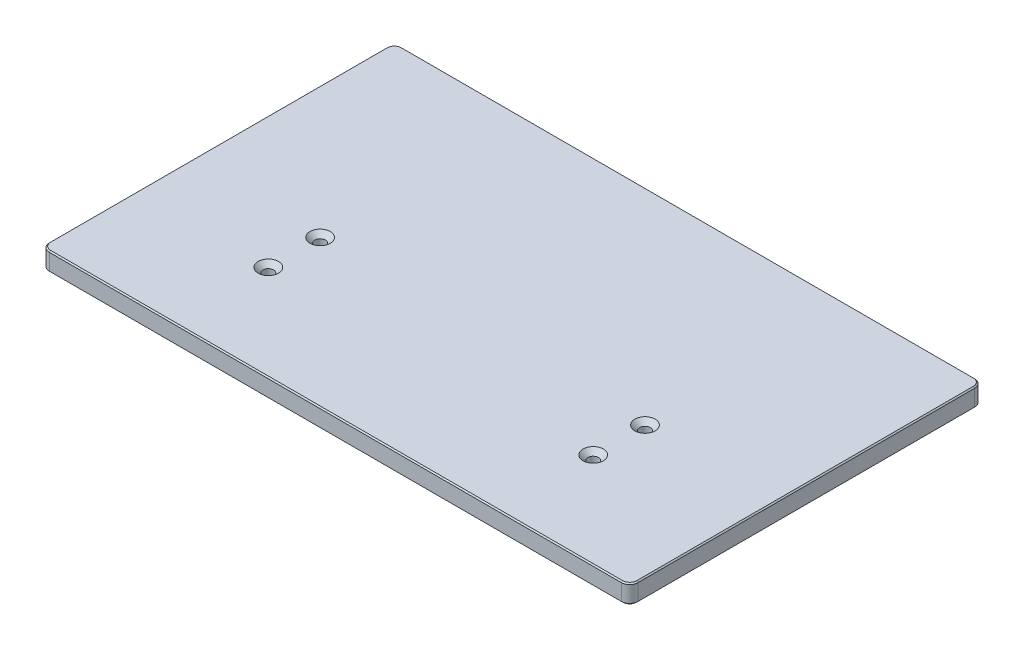
ISO-10303-21;
HEADER;
FILE_DESCRIPTION(('STEP AP214'),'2;1');
FILE_NAME('part.step','',(''),(''),'','','');
FILE_SCHEMA(('AUTOMOTIVE_DESIGN { 1 0 10303 214 1 1 1 1 }'));
ENDSEC;
DATA;
#1=APPLICATION_CONTEXT('core data for automotive mechanical design processes');
#2=APPLICATION_PROTOCOL_DEFINITION('international standard','automotive_design',2000,#1);
#3=PRODUCT_CONTEXT('',#1,'mechanical');
#4=PRODUCT('Part','Part','',(#3));
#5=PRODUCT_RELATED_PRODUCT_CATEGORY('part','',(#4));
#6=PRODUCT_DEFINITION_FORMATION('','',#4);
#7=PRODUCT_DEFINITION_CONTEXT('part definition',#1,'design');
#8=PRODUCT_DEFINITION('design','',#6,#7);
#9=PRODUCT_DEFINITION_SHAPE('','',#8);
#10=(LENGTH_UNIT() NAMED_UNIT(*) SI_UNIT(.MILLI.,.METRE.));
#11=(NAMED_UNIT(*) PLANE_ANGLE_UNIT() SI_UNIT($,.RADIAN.));
#12=(NAMED_UNIT(*) SI_UNIT($,.STERADIAN.) SOLID_ANGLE_UNIT());
#13=UNCERTAINTY_MEASURE_WITH_UNIT(LENGTH_MEASURE(1.E-05),#10,'distance_accuracy_value','');
#14=(GEOMETRIC_REPRESENTATION_CONTEXT(3) GLOBAL_UNCERTAINTY_ASSIGNED_CONTEXT((#13)) GLOBAL_UNIT_ASSIGNED_CONTEXT((#10,
#11,#12)) REPRESENTATION_CONTEXT('',''));
#15=CARTESIAN_POINT('',(0.,0.,0.));
#16=DIRECTION('',(0.,0.,1.));
#17=DIRECTION('',(1.,0.,0.));
#18=AXIS2_PLACEMENT_3D('',#15,#16,#17);
#19=CARTESIAN_POINT('',(0.,0.,0.));
#20=DIRECTION('',(0.,-1.,0.));
#21=DIRECTION('',(0.,0.,-1.));
#22=AXIS2_PLACEMENT_3D('',#19,#20,#21);
#23=PLANE('',#22);
#24=CARTESIAN_POINT('',(243.,0.,-143.));
#25=DIRECTION('',(0.,-1.,0.));
#26=DIRECTION('',(0.,0.,-1.));
#27=AXIS2_PLACEMENT_3D('',#24,#25,#26);
#28=CIRCLE('',#27,6.00000000000001);
#29=CARTESIAN_POINT('',(243.,0.,-149.));
#30=VERTEX_POINT('',#29);
#31=CARTESIAN_POINT('',(249.,0.,-143.));
#32=VERTEX_POINT('',#31);
#33=EDGE_CURVE('E224',#30,#32,#28,.T.);
#34=ORIENTED_EDGE('',*,*,#33,.T.);
#35=DIRECTION('',(0.,0.,1.));
#36=VECTOR('',#35,1.);
#37=CARTESIAN_POINT('',(249.,0.,143.));
#38=LINE('',#37,#36);
#39=CARTESIAN_POINT('',(249.,0.,143.));
#40=VERTEX_POINT('',#39);
#41=EDGE_CURVE('E170',#32,#40,#38,.T.);
#42=ORIENTED_EDGE('',*,*,#41,.T.);
#43=CARTESIAN_POINT('',(243.,0.,143.));
#44=DIRECTION('',(0.,-1.,0.));
#45=DIRECTION('',(0.,0.,-1.));
#46=AXIS2_PLACEMENT_3D('',#43,#44,#45);
#47=CIRCLE('',#46,6.00000000000001);
#48=CARTESIAN_POINT('',(243.,0.,149.));
#49=VERTEX_POINT('',#48);
#50=EDGE_CURVE('E222',#40,#49,#47,.T.);
#51=ORIENTED_EDGE('',*,*,#50,.T.);
#52=DIRECTION('',(-1.,0.,0.));
#53=VECTOR('',#52,1.);
#54=CARTESIAN_POINT('',(-243.,0.,149.));
#55=LINE('',#54,#53);
#56=CARTESIAN_POINT('',(-243.,0.,149.));
#57=VERTEX_POINT('',#56);
#58=EDGE_CURVE('E218',#49,#57,#55,.T.);
#59=ORIENTED_EDGE('',*,*,#58,.T.);
#60=CARTESIAN_POINT('',(-243.,0.,143.));
#61=DIRECTION('',(0.,-1.,0.));
#62=DIRECTION('',(0.,0.,-1.));
#63=AXIS2_PLACEMENT_3D('',#60,#61,#62);
#64=CIRCLE('',#63,6.00000000000001);
#65=CARTESIAN_POINT('',(-249.,0.,143.));
#66=VERTEX_POINT('',#65);
#67=EDGE_CURVE('E214',#57,#66,#64,.T.);
#68=ORIENTED_EDGE('',*,*,#67,.T.);
#69=DIRECTION('',(0.,0.,-1.));
#70=VECTOR('',#69,1.);
#71=CARTESIAN_POINT('',(-249.,0.,-143.));
#72=LINE('',#71,#70);
#73=CARTESIAN_POINT('',(-249.,0.,-143.));
#74=VERTEX_POINT('',#73);
#75=EDGE_CURVE('E196',#66,#74,#72,.T.);
#76=ORIENTED_EDGE('',*,*,#75,.T.);
#77=CARTESIAN_POINT('',(-243.,0.,-143.));
#78=DIRECTION('',(0.,-1.,0.));
#79=DIRECTION('',(0.,0.,-1.));
#80=AXIS2_PLACEMENT_3D('',#77,#78,#79);
#81=CIRCLE('',#80,6.00000000000001);
#82=CARTESIAN_POINT('',(-243.,0.,-149.));
#83=VERTEX_POINT('',#82);
#84=EDGE_CURVE('E216',#74,#83,#81,.T.);
#85=ORIENTED_EDGE('',*,*,#84,.T.);
#86=DIRECTION('',(1.,0.,0.));
#87=VECTOR('',#86,1.);
#88=CARTESIAN_POINT('',(243.,0.,-149.));
#89=LINE('',#88,#87);
#90=EDGE_CURVE('E220',#83,#30,#89,.T.);
#91=ORIENTED_EDGE('',*,*,#90,.T.);
#92=EDGE_LOOP('',(#34,#42,#51,#59,#68,#76,#85,#91));
#93=FACE_BOUND('',#92,.T.);
#94=CARTESIAN_POINT('',(138.,0.,69.));
#95=DIRECTION('',(0.,1.,0.));
#96=DIRECTION('',(0.,0.,1.));
#97=AXIS2_PLACEMENT_3D('',#94,#95,#96);
#98=CIRCLE('',#97,4.5);
#99=CARTESIAN_POINT('',(138.,0.,73.5));
#100=VERTEX_POINT('',#99);
#101=EDGE_CURVE('E283',#100,#100,#98,.T.);
#102=ORIENTED_EDGE('',*,*,#101,.T.);
#103=EDGE_LOOP('',(#102));
#104=FACE_BOUND('',#103,.T.);
#105=CARTESIAN_POINT('',(138.,0.,25.));
#106=DIRECTION('',(0.,1.,0.));
#107=DIRECTION('',(0.,0.,1.));
#108=AXIS2_PLACEMENT_3D('',#105,#106,#107);
#109=CIRCLE('',#108,4.5);
#110=CARTESIAN_POINT('',(138.,0.,29.5));
#111=VERTEX_POINT('',#110);
#112=EDGE_CURVE('E734',#111,#111,#109,.T.);
#113=ORIENTED_EDGE('',*,*,#112,.T.);
#114=EDGE_LOOP('',(#113));
#115=FACE_BOUND('',#114,.T.);
#116=CARTESIAN_POINT('',(-138.,0.,69.));
#117=DIRECTION('',(0.,1.,0.));
#118=DIRECTION('',(0.,0.,1.));
#119=AXIS2_PLACEMENT_3D('',#116,#117,#118);
#120=CIRCLE('',#119,4.5);
#121=CARTESIAN_POINT('',(-138.,0.,73.5));
#122=VERTEX_POINT('',#121);
#123=EDGE_CURVE('E745',#122,#122,#120,.T.);
#124=ORIENTED_EDGE('',*,*,#123,.T.);
#125=EDGE_LOOP('',(#124));
#126=FACE_BOUND('',#125,.T.);
#127=CARTESIAN_POINT('',(-138.,0.,25.));
#128=DIRECTION('',(0.,1.,0.));
#129=DIRECTION('',(0.,0.,1.));
#130=AXIS2_PLACEMENT_3D('',#127,#128,#129);
#131=CIRCLE('',#130,4.5);
#132=CARTESIAN_POINT('',(-138.,0.,29.5));
#133=VERTEX_POINT('',#132);
#134=EDGE_CURVE('E754',#133,#133,#131,.T.);
#135=ORIENTED_EDGE('',*,*,#134,.T.);
#136=EDGE_LOOP('',(#135));
#137=FACE_BOUND('',#136,.T.);
#138=ADVANCED_FACE('F45',(#93,#104,#115,#126,#137),#23,.T.);
#139=CARTESIAN_POINT('',(250.,15.875,150.));
#140=DIRECTION('',(-1.,0.,0.));
#141=DIRECTION('',(0.,0.,1.));
#142=AXIS2_PLACEMENT_3D('',#139,#140,#141);
#143=PLANE('',#142);
#144=DIRECTION('',(0.,-1.,0.));
#145=VECTOR('',#144,1.);
#146=CARTESIAN_POINT('',(250.,15.875,143.));
#147=LINE('',#146,#145);
#148=CARTESIAN_POINT('',(250.,14.8750000000001,143.));
#149=VERTEX_POINT('',#148);
#150=CARTESIAN_POINT('',(250.,0.999999999999945,143.));
#151=VERTEX_POINT('',#150);
#152=EDGE_CURVE('E194',#149,#151,#147,.T.);
#153=ORIENTED_EDGE('',*,*,#152,.T.);
#154=DIRECTION('',(0.,0.,-1.));
#155=VECTOR('',#154,1.);
#156=CARTESIAN_POINT('',(250.,0.999999999999945,-143.));
#157=LINE('',#156,#155);
#158=CARTESIAN_POINT('',(250.,0.999999999999945,-143.));
#159=VERTEX_POINT('',#158);
#160=EDGE_CURVE('E168',#151,#159,#157,.T.);
#161=ORIENTED_EDGE('',*,*,#160,.T.);
#162=DIRECTION('',(0.,-1.,0.));
#163=VECTOR('',#162,1.);
#164=CARTESIAN_POINT('',(250.,15.875,-143.));
#165=LINE('',#164,#163);
#166=CARTESIAN_POINT('',(250.,14.8750000000001,-143.));
#167=VERTEX_POINT('',#166);
#168=EDGE_CURVE('E192',#159,#167,#165,.F.);
#169=ORIENTED_EDGE('',*,*,#168,.T.);
#170=DIRECTION('',(0.,0.,1.));
#171=VECTOR('',#170,1.);
#172=CARTESIAN_POINT('',(250.,14.8750000000001,150.));
#173=LINE('',#172,#171);
#174=EDGE_CURVE('E197',#167,#149,#173,.T.);
#175=ORIENTED_EDGE('',*,*,#174,.T.);
#176=EDGE_LOOP('',(#153,#161,#169,#175));
#177=FACE_BOUND('',#176,.T.);
#178=ADVANCED_FACE('F190',(#177),#143,.F.);
#179=CARTESIAN_POINT('',(-250.,15.875,-150.));
#180=DIRECTION('',(0.,0.,1.));
#181=DIRECTION('',(1.,0.,0.));
#182=AXIS2_PLACEMENT_3D('',#179,#180,#181);
#183=PLANE('',#182);
#184=DIRECTION('',(0.,-1.,0.));
#185=VECTOR('',#184,1.);
#186=CARTESIAN_POINT('',(243.,15.875,-150.));
#187=LINE('',#186,#185);
#188=CARTESIAN_POINT('',(243.,14.8750000000001,-150.));
#189=VERTEX_POINT('',#188);
#190=CARTESIAN_POINT('',(243.,0.999999999999945,-150.));
#191=VERTEX_POINT('',#190);
#192=EDGE_CURVE('E325',#189,#191,#187,.T.);
#193=ORIENTED_EDGE('',*,*,#192,.T.);
#194=DIRECTION('',(-1.,0.,0.));
#195=VECTOR('',#194,1.);
#196=CARTESIAN_POINT('',(-243.,0.999999999999945,-150.));
#197=LINE('',#196,#195);
#198=CARTESIAN_POINT('',(-243.,0.999999999999945,-150.));
#199=VERTEX_POINT('',#198);
#200=EDGE_CURVE('E233',#191,#199,#197,.T.);
#201=ORIENTED_EDGE('',*,*,#200,.T.);
#202=DIRECTION('',(0.,-1.,0.));
#203=VECTOR('',#202,1.);
#204=CARTESIAN_POINT('',(-243.,15.875,-150.));
#205=LINE('',#204,#203);
#206=CARTESIAN_POINT('',(-243.,14.8750000000001,-150.));
#207=VERTEX_POINT('',#206);
#208=EDGE_CURVE('E206',#199,#207,#205,.F.);
#209=ORIENTED_EDGE('',*,*,#208,.T.);
#210=DIRECTION('',(1.,0.,0.));
#211=VECTOR('',#210,1.);
#212=CARTESIAN_POINT('',(-250.,14.8750000000001,-150.));
#213=LINE('',#212,#211);
#214=EDGE_CURVE('E231',#207,#189,#213,.T.);
#215=ORIENTED_EDGE('',*,*,#214,.T.);
#216=EDGE_LOOP('',(#193,#201,#209,#215));
#217=FACE_BOUND('',#216,.T.);
#218=ADVANCED_FACE('F332',(#217),#183,.F.);
#219=CARTESIAN_POINT('',(-250.,15.875,150.));
#220=DIRECTION('',(1.,0.,0.));
#221=DIRECTION('',(0.,0.,-1.));
#222=AXIS2_PLACEMENT_3D('',#219,#220,#221);
#223=PLANE('',#222);
#224=DIRECTION('',(0.,-1.,0.));
#225=VECTOR('',#224,1.);
#226=CARTESIAN_POINT('',(-250.,15.875,-143.));
#227=LINE('',#226,#225);
#228=CARTESIAN_POINT('',(-250.,14.8750000000001,-143.));
#229=VERTEX_POINT('',#228);
#230=CARTESIAN_POINT('',(-250.,0.999999999999945,-143.));
#231=VERTEX_POINT('',#230);
#232=EDGE_CURVE('E317',#229,#231,#227,.T.);
#233=ORIENTED_EDGE('',*,*,#232,.T.);
#234=DIRECTION('',(0.,0.,1.));
#235=VECTOR('',#234,1.);
#236=CARTESIAN_POINT('',(-250.,0.999999999999945,143.));
#237=LINE('',#236,#235);
#238=CARTESIAN_POINT('',(-250.,0.999999999999945,143.));
#239=VERTEX_POINT('',#238);
#240=EDGE_CURVE('E249',#231,#239,#237,.T.);
#241=ORIENTED_EDGE('',*,*,#240,.T.);
#242=DIRECTION('',(0.,-1.,0.));
#243=VECTOR('',#242,1.);
#244=CARTESIAN_POINT('',(-250.,15.875,143.));
#245=LINE('',#244,#243);
#246=CARTESIAN_POINT('',(-250.,14.8750000000001,143.));
#247=VERTEX_POINT('',#246);
#248=EDGE_CURVE('E280',#239,#247,#245,.F.);
#249=ORIENTED_EDGE('',*,*,#248,.T.);
#250=DIRECTION('',(0.,0.,-1.));
#251=VECTOR('',#250,1.);
#252=CARTESIAN_POINT('',(-250.,14.8750000000001,150.));
#253=LINE('',#252,#251);
#254=EDGE_CURVE('E247',#247,#229,#253,.T.);
#255=ORIENTED_EDGE('',*,*,#254,.T.);
#256=EDGE_LOOP('',(#233,#241,#249,#255));
#257=FACE_BOUND('',#256,.T.);
#258=ADVANCED_FACE('F316',(#257),#223,.F.);
#259=CARTESIAN_POINT('',(-250.,15.875,150.));
#260=DIRECTION('',(0.,0.,-1.));
#261=DIRECTION('',(-1.,0.,0.));
#262=AXIS2_PLACEMENT_3D('',#259,#260,#261);
#263=PLANE('',#262);
#264=DIRECTION('',(0.,-1.,0.));
#265=VECTOR('',#264,1.);
#266=CARTESIAN_POINT('',(-243.,15.875,150.));
#267=LINE('',#266,#265);
#268=CARTESIAN_POINT('',(-243.,14.8750000000001,150.));
#269=VERTEX_POINT('',#268);
#270=CARTESIAN_POINT('',(-243.,0.999999999999945,150.));
#271=VERTEX_POINT('',#270);
#272=EDGE_CURVE('E201',#269,#271,#267,.T.);
#273=ORIENTED_EDGE('',*,*,#272,.T.);
#274=DIRECTION('',(1.,0.,0.));
#275=VECTOR('',#274,1.);
#276=CARTESIAN_POINT('',(243.,0.999999999999945,150.));
#277=LINE('',#276,#275);
#278=CARTESIAN_POINT('',(243.,0.999999999999945,150.));
#279=VERTEX_POINT('',#278);
#280=EDGE_CURVE('E237',#271,#279,#277,.T.);
#281=ORIENTED_EDGE('',*,*,#280,.T.);
#282=DIRECTION('',(0.,-1.,0.));
#283=VECTOR('',#282,1.);
#284=CARTESIAN_POINT('',(243.,15.875,150.));
#285=LINE('',#284,#283);
#286=CARTESIAN_POINT('',(243.,14.8750000000001,150.));
#287=VERTEX_POINT('',#286);
#288=EDGE_CURVE('E204',#279,#287,#285,.F.);
#289=ORIENTED_EDGE('',*,*,#288,.T.);
#290=DIRECTION('',(-1.,0.,0.));
#291=VECTOR('',#290,1.);
#292=CARTESIAN_POINT('',(-250.,14.8750000000001,150.));
#293=LINE('',#292,#291);
#294=EDGE_CURVE('E235',#287,#269,#293,.T.);
#295=ORIENTED_EDGE('',*,*,#294,.T.);
#296=EDGE_LOOP('',(#273,#281,#289,#295));
#297=FACE_BOUND('',#296,.T.);
#298=ADVANCED_FACE('F377',(#297),#263,.F.);
#299=CARTESIAN_POINT('',(0.,15.875,0.));
#300=DIRECTION('',(0.,-1.,0.));
#301=DIRECTION('',(0.,0.,-1.));
#302=AXIS2_PLACEMENT_3D('',#299,#300,#301);
#303=PLANE('',#302);
#304=CARTESIAN_POINT('',(-138.,15.875,25.));
#305=DIRECTION('',(0.,1.,0.));
#306=DIRECTION('',(0.,0.,1.));
#307=AXIS2_PLACEMENT_3D('',#304,#305,#306);
#308=CIRCLE('',#307,8.64999999999999);
#309=CARTESIAN_POINT('',(-138.,15.875,33.65));
#310=VERTEX_POINT('',#309);
#311=EDGE_CURVE('E760',#310,#310,#308,.T.);
#312=ORIENTED_EDGE('',*,*,#311,.F.);
#313=EDGE_LOOP('',(#312));
#314=FACE_BOUND('',#313,.T.);
#315=CARTESIAN_POINT('',(-138.,15.875,69.));
#316=DIRECTION('',(0.,1.,0.));
#317=DIRECTION('',(0.,0.,1.));
#318=AXIS2_PLACEMENT_3D('',#315,#316,#317);
#319=CIRCLE('',#318,8.64999999999999);
#320=CARTESIAN_POINT('',(-138.,15.875,77.65));
#321=VERTEX_POINT('',#320);
#322=EDGE_CURVE('E751',#321,#321,#319,.T.);
#323=ORIENTED_EDGE('',*,*,#322,.F.);
#324=EDGE_LOOP('',(#323));
#325=FACE_BOUND('',#324,.T.);
#326=CARTESIAN_POINT('',(138.,15.875,25.));
#327=DIRECTION('',(0.,1.,0.));
#328=DIRECTION('',(0.,0.,1.));
#329=AXIS2_PLACEMENT_3D('',#326,#327,#328);
#330=CIRCLE('',#329,8.64999999999999);
#331=CARTESIAN_POINT('',(138.,15.875,33.65));
#332=VERTEX_POINT('',#331);
#333=EDGE_CURVE('E742',#332,#332,#330,.T.);
#334=ORIENTED_EDGE('',*,*,#333,.F.);
#335=EDGE_LOOP('',(#334));
#336=FACE_BOUND('',#335,.T.);
#337=CARTESIAN_POINT('',(138.,15.875,69.));
#338=DIRECTION('',(0.,1.,0.));
#339=DIRECTION('',(0.,0.,1.));
#340=AXIS2_PLACEMENT_3D('',#337,#338,#339);
#341=CIRCLE('',#340,8.64999999999999);
#342=CARTESIAN_POINT('',(138.,15.875,77.65));
#343=VERTEX_POINT('',#342);
#344=EDGE_CURVE('E731',#343,#343,#341,.T.);
#345=ORIENTED_EDGE('',*,*,#344,.F.);
#346=EDGE_LOOP('',(#345));
#347=FACE_BOUND('',#346,.T.);
#348=CARTESIAN_POINT('',(243.,15.875,143.));
#349=DIRECTION('',(0.,-1.,0.));
#350=DIRECTION('',(0.,0.,-1.));
#351=AXIS2_PLACEMENT_3D('',#348,#349,#350);
#352=CIRCLE('',#351,6.00000000000001);
#353=CARTESIAN_POINT('',(243.,15.875,149.));
#354=VERTEX_POINT('',#353);
#355=CARTESIAN_POINT('',(249.,15.875,143.));
#356=VERTEX_POINT('',#355);
#357=EDGE_CURVE('E70',#354,#356,#352,.F.);
#358=ORIENTED_EDGE('',*,*,#357,.T.);
#359=DIRECTION('',(0.,0.,-1.));
#360=VECTOR('',#359,1.);
#361=CARTESIAN_POINT('',(249.,15.875,0.));
#362=LINE('',#361,#360);
#363=CARTESIAN_POINT('',(249.,15.875,-143.));
#364=VERTEX_POINT('',#363);
#365=EDGE_CURVE('E11',#356,#364,#362,.T.);
#366=ORIENTED_EDGE('',*,*,#365,.T.);
#367=CARTESIAN_POINT('',(243.,15.875,-143.));
#368=DIRECTION('',(0.,-1.,0.));
#369=DIRECTION('',(0.,0.,-1.));
#370=AXIS2_PLACEMENT_3D('',#367,#368,#369);
#371=CIRCLE('',#370,6.00000000000001);
#372=CARTESIAN_POINT('',(243.,15.875,-149.));
#373=VERTEX_POINT('',#372);
#374=EDGE_CURVE('E55',#364,#373,#371,.F.);
#375=ORIENTED_EDGE('',*,*,#374,.T.);
#376=DIRECTION('',(-1.,0.,0.));
#377=VECTOR('',#376,1.);
#378=CARTESIAN_POINT('',(0.,15.875,-149.));
#379=LINE('',#378,#377);
#380=CARTESIAN_POINT('',(-243.,15.875,-149.));
#381=VERTEX_POINT('',#380);
#382=EDGE_CURVE('E259',#373,#381,#379,.T.);
#383=ORIENTED_EDGE('',*,*,#382,.T.);
#384=CARTESIAN_POINT('',(-243.,15.875,-143.));
#385=DIRECTION('',(0.,-1.,0.));
#386=DIRECTION('',(0.,0.,-1.));
#387=AXIS2_PLACEMENT_3D('',#384,#385,#386);
#388=CIRCLE('',#387,6.00000000000001);
#389=CARTESIAN_POINT('',(-249.,15.875,-143.));
#390=VERTEX_POINT('',#389);
#391=EDGE_CURVE('E255',#381,#390,#388,.F.);
#392=ORIENTED_EDGE('',*,*,#391,.T.);
#393=DIRECTION('',(0.,0.,1.));
#394=VECTOR('',#393,1.);
#395=CARTESIAN_POINT('',(-249.,15.875,0.));
#396=LINE('',#395,#394);
#397=CARTESIAN_POINT('',(-249.,15.875,143.));
#398=VERTEX_POINT('',#397);
#399=EDGE_CURVE('E251',#390,#398,#396,.T.);
#400=ORIENTED_EDGE('',*,*,#399,.T.);
#401=CARTESIAN_POINT('',(-243.,15.875,143.));
#402=DIRECTION('',(0.,-1.,0.));
#403=DIRECTION('',(0.,0.,-1.));
#404=AXIS2_PLACEMENT_3D('',#401,#402,#403);
#405=CIRCLE('',#404,6.00000000000001);
#406=CARTESIAN_POINT('',(-243.,15.875,149.));
#407=VERTEX_POINT('',#406);
#408=EDGE_CURVE('E253',#398,#407,#405,.F.);
#409=ORIENTED_EDGE('',*,*,#408,.T.);
#410=DIRECTION('',(1.,0.,0.));
#411=VECTOR('',#410,1.);
#412=CARTESIAN_POINT('',(0.,15.875,149.));
#413=LINE('',#412,#411);
#414=EDGE_CURVE('E257',#407,#354,#413,.T.);
#415=ORIENTED_EDGE('',*,*,#414,.T.);
#416=EDGE_LOOP('',(#358,#366,#375,#383,#392,#400,#409,#415));
#417=FACE_BOUND('',#416,.T.);
#418=ADVANCED_FACE('F342',(#314,#325,#336,#347,#417),#303,.F.);
#419=CARTESIAN_POINT('',(-243.,15.875,-143.));
#420=DIRECTION('',(0.,-1.,0.));
#421=DIRECTION('',(0.,0.,-1.));
#422=AXIS2_PLACEMENT_3D('',#419,#420,#421);
#423=CYLINDRICAL_SURFACE('',#422,7.);
#424=ORIENTED_EDGE('',*,*,#208,.F.);
#425=CARTESIAN_POINT('',(-243.,0.999999999999945,-143.));
#426=DIRECTION('',(0.,-1.,0.));
#427=DIRECTION('',(0.,0.,-1.));
#428=AXIS2_PLACEMENT_3D('',#425,#426,#427);
#429=CIRCLE('',#428,7.);
#430=EDGE_CURVE('E241',#199,#231,#429,.F.);
#431=ORIENTED_EDGE('',*,*,#430,.T.);
#432=ORIENTED_EDGE('',*,*,#232,.F.);
#433=CARTESIAN_POINT('',(-243.,14.8750000000001,-143.));
#434=DIRECTION('',(0.,-1.,0.));
#435=DIRECTION('',(0.,0.,-1.));
#436=AXIS2_PLACEMENT_3D('',#433,#434,#435);
#437=CIRCLE('',#436,7.);
#438=EDGE_CURVE('E239',#229,#207,#437,.T.);
#439=ORIENTED_EDGE('',*,*,#438,.T.);
#440=EDGE_LOOP('',(#424,#431,#432,#439));
#441=FACE_BOUND('',#440,.T.);
#442=ADVANCED_FACE('F322',(#441),#423,.T.);
#443=CARTESIAN_POINT('',(243.,15.875,-143.));
#444=DIRECTION('',(0.,-1.,0.));
#445=DIRECTION('',(0.,0.,-1.));
#446=AXIS2_PLACEMENT_3D('',#443,#444,#445);
#447=CYLINDRICAL_SURFACE('',#446,7.);
#448=ORIENTED_EDGE('',*,*,#168,.F.);
#449=CARTESIAN_POINT('',(243.,0.999999999999945,-143.));
#450=DIRECTION('',(0.,-1.,0.));
#451=DIRECTION('',(0.,0.,-1.));
#452=AXIS2_PLACEMENT_3D('',#449,#450,#451);
#453=CIRCLE('',#452,7.);
#454=EDGE_CURVE('E176',#159,#191,#453,.F.);
#455=ORIENTED_EDGE('',*,*,#454,.T.);
#456=ORIENTED_EDGE('',*,*,#192,.F.);
#457=CARTESIAN_POINT('',(243.,14.8750000000001,-143.));
#458=DIRECTION('',(0.,-1.,0.));
#459=DIRECTION('',(0.,0.,-1.));
#460=AXIS2_PLACEMENT_3D('',#457,#458,#459);
#461=CIRCLE('',#460,7.);
#462=EDGE_CURVE('E185',#189,#167,#461,.T.);
#463=ORIENTED_EDGE('',*,*,#462,.T.);
#464=EDGE_LOOP('',(#448,#455,#456,#463));
#465=FACE_BOUND('',#464,.T.);
#466=ADVANCED_FACE('F199',(#465),#447,.T.);
#467=CARTESIAN_POINT('',(243.,15.875,143.));
#468=DIRECTION('',(0.,-1.,0.));
#469=DIRECTION('',(0.,0.,-1.));
#470=AXIS2_PLACEMENT_3D('',#467,#468,#469);
#471=CYLINDRICAL_SURFACE('',#470,7.);
#472=ORIENTED_EDGE('',*,*,#288,.F.);
#473=CARTESIAN_POINT('',(243.,0.999999999999945,143.));
#474=DIRECTION('',(0.,-1.,0.));
#475=DIRECTION('',(0.,0.,-1.));
#476=AXIS2_PLACEMENT_3D('',#473,#474,#475);
#477=CIRCLE('',#476,7.);
#478=EDGE_CURVE('E229',#279,#151,#477,.F.);
#479=ORIENTED_EDGE('',*,*,#478,.T.);
#480=ORIENTED_EDGE('',*,*,#152,.F.);
#481=CARTESIAN_POINT('',(243.,14.8750000000001,143.));
#482=DIRECTION('',(0.,-1.,0.));
#483=DIRECTION('',(0.,0.,-1.));
#484=AXIS2_PLACEMENT_3D('',#481,#482,#483);
#485=CIRCLE('',#484,7.);
#486=EDGE_CURVE('E184',#149,#287,#485,.T.);
#487=ORIENTED_EDGE('',*,*,#486,.T.);
#488=EDGE_LOOP('',(#472,#479,#480,#487));
#489=FACE_BOUND('',#488,.T.);
#490=ADVANCED_FACE('F350',(#489),#471,.T.);
#491=CARTESIAN_POINT('',(-243.,15.875,143.));
#492=DIRECTION('',(0.,-1.,0.));
#493=DIRECTION('',(0.,0.,-1.));
#494=AXIS2_PLACEMENT_3D('',#491,#492,#493);
#495=CYLINDRICAL_SURFACE('',#494,7.);
#496=ORIENTED_EDGE('',*,*,#248,.F.);
#497=CARTESIAN_POINT('',(-243.,0.999999999999945,143.));
#498=DIRECTION('',(0.,-1.,0.));
#499=DIRECTION('',(0.,0.,-1.));
#500=AXIS2_PLACEMENT_3D('',#497,#498,#499);
#501=CIRCLE('',#500,7.);
#502=EDGE_CURVE('E245',#239,#271,#501,.F.);
#503=ORIENTED_EDGE('',*,*,#502,.T.);
#504=ORIENTED_EDGE('',*,*,#272,.F.);
#505=CARTESIAN_POINT('',(-243.,14.8750000000001,143.));
#506=DIRECTION('',(0.,-1.,0.));
#507=DIRECTION('',(0.,0.,-1.));
#508=AXIS2_PLACEMENT_3D('',#505,#506,#507);
#509=CIRCLE('',#508,7.);
#510=EDGE_CURVE('E243',#269,#247,#509,.T.);
#511=ORIENTED_EDGE('',*,*,#510,.T.);
#512=EDGE_LOOP('',(#496,#503,#504,#511));
#513=FACE_BOUND('',#512,.T.);
#514=ADVANCED_FACE('F373',(#513),#495,.T.);
#515=CARTESIAN_POINT('',(-250.,0.999999999999945,150.));
#516=DIRECTION('',(-0.707106781186528,-0.707106781186567,0.));
#517=DIRECTION('',(0.,0.,-1.));
#518=AXIS2_PLACEMENT_3D('',#515,#516,#517);
#519=PLANE('',#518);
#520=DIRECTION('',(-0.707106781186567,0.707106781186528,0.));
#521=VECTOR('',#520,1.);
#522=CARTESIAN_POINT('',(-249.,0.,-143.));
#523=LINE('',#522,#521);
#524=EDGE_CURVE('E274',#74,#231,#523,.T.);
#525=ORIENTED_EDGE('',*,*,#524,.F.);
#526=ORIENTED_EDGE('',*,*,#75,.F.);
#527=DIRECTION('',(0.707106781186567,-0.707106781186528,0.));
#528=VECTOR('',#527,1.);
#529=CARTESIAN_POINT('',(-250.,0.999999999999945,143.));
#530=LINE('',#529,#528);
#531=EDGE_CURVE('E277',#239,#66,#530,.T.);
#532=ORIENTED_EDGE('',*,*,#531,.F.);
#533=ORIENTED_EDGE('',*,*,#240,.F.);
#534=EDGE_LOOP('',(#525,#526,#532,#533));
#535=FACE_BOUND('',#534,.T.);
#536=ADVANCED_FACE('F369',(#535),#519,.T.);
#537=CARTESIAN_POINT('',(-243.,0.,143.));
#538=DIRECTION('',(0.,1.,0.));
#539=DIRECTION('',(0.,0.,1.));
#540=AXIS2_PLACEMENT_3D('',#537,#538,#539);
#541=CONICAL_SURFACE('',#540,6.00000000000001,0.785398163397473);
#542=ORIENTED_EDGE('',*,*,#531,.T.);
#543=ORIENTED_EDGE('',*,*,#67,.F.);
#544=DIRECTION('',(0.,-0.707106781186528,-0.707106781186567));
#545=VECTOR('',#544,1.);
#546=CARTESIAN_POINT('',(-243.,0.999999999999945,150.));
#547=LINE('',#546,#545);
#548=EDGE_CURVE('E271',#271,#57,#547,.T.);
#549=ORIENTED_EDGE('',*,*,#548,.F.);
#550=ORIENTED_EDGE('',*,*,#502,.F.);
#551=EDGE_LOOP('',(#542,#543,#549,#550));
#552=FACE_BOUND('',#551,.T.);
#553=ADVANCED_FACE('F382',(#552),#541,.T.);
#554=CARTESIAN_POINT('',(-243.,0.,-143.));
#555=DIRECTION('',(0.,1.,0.));
#556=DIRECTION('',(0.,0.,1.));
#557=AXIS2_PLACEMENT_3D('',#554,#555,#556);
#558=CONICAL_SURFACE('',#557,6.00000000000001,0.785398163397473);
#559=ORIENTED_EDGE('',*,*,#524,.T.);
#560=ORIENTED_EDGE('',*,*,#430,.F.);
#561=DIRECTION('',(0.,0.707106781186528,-0.707106781186567));
#562=VECTOR('',#561,1.);
#563=CARTESIAN_POINT('',(-243.,0.,-149.));
#564=LINE('',#563,#562);
#565=EDGE_CURVE('E268',#83,#199,#564,.T.);
#566=ORIENTED_EDGE('',*,*,#565,.F.);
#567=ORIENTED_EDGE('',*,*,#84,.F.);
#568=EDGE_LOOP('',(#559,#560,#566,#567));
#569=FACE_BOUND('',#568,.T.);
#570=ADVANCED_FACE('F365',(#569),#558,.T.);
#571=CARTESIAN_POINT('',(-250.,0.999999999999945,150.));
#572=DIRECTION('',(0.,-0.707106781186567,0.707106781186528));
#573=DIRECTION('',(-1.,0.,0.));
#574=AXIS2_PLACEMENT_3D('',#571,#572,#573);
#575=PLANE('',#574);
#576=ORIENTED_EDGE('',*,*,#548,.T.);
#577=ORIENTED_EDGE('',*,*,#58,.F.);
#578=DIRECTION('',(0.,-0.707106781186528,-0.707106781186567));
#579=VECTOR('',#578,1.);
#580=CARTESIAN_POINT('',(243.,0.999999999999945,150.));
#581=LINE('',#580,#579);
#582=EDGE_CURVE('E265',#279,#49,#581,.T.);
#583=ORIENTED_EDGE('',*,*,#582,.F.);
#584=ORIENTED_EDGE('',*,*,#280,.F.);
#585=EDGE_LOOP('',(#576,#577,#583,#584));
#586=FACE_BOUND('',#585,.T.);
#587=ADVANCED_FACE('F384',(#586),#575,.T.);
#588=CARTESIAN_POINT('',(-250.,0.999999999999945,-150.));
#589=DIRECTION('',(0.,-0.707106781186567,-0.707106781186528));
#590=DIRECTION('',(1.,0.,0.));
#591=AXIS2_PLACEMENT_3D('',#588,#589,#590);
#592=PLANE('',#591);
#593=ORIENTED_EDGE('',*,*,#565,.T.);
#594=ORIENTED_EDGE('',*,*,#200,.F.);
#595=DIRECTION('',(0.,0.707106781186528,-0.707106781186567));
#596=VECTOR('',#595,1.);
#597=CARTESIAN_POINT('',(243.,0.,-149.));
#598=LINE('',#597,#596);
#599=EDGE_CURVE('E179',#30,#191,#598,.T.);
#600=ORIENTED_EDGE('',*,*,#599,.F.);
#601=ORIENTED_EDGE('',*,*,#90,.F.);
#602=EDGE_LOOP('',(#593,#594,#600,#601));
#603=FACE_BOUND('',#602,.T.);
#604=ADVANCED_FACE('F363',(#603),#592,.T.);
#605=CARTESIAN_POINT('',(243.,0.,143.));
#606=DIRECTION('',(0.,1.,0.));
#607=DIRECTION('',(0.,0.,1.));
#608=AXIS2_PLACEMENT_3D('',#605,#606,#607);
#609=CONICAL_SURFACE('',#608,6.00000000000001,0.785398163397473);
#610=ORIENTED_EDGE('',*,*,#582,.T.);
#611=ORIENTED_EDGE('',*,*,#50,.F.);
#612=DIRECTION('',(-0.707106781186567,-0.707106781186528,0.));
#613=VECTOR('',#612,1.);
#614=CARTESIAN_POINT('',(250.,0.999999999999945,143.));
#615=LINE('',#614,#613);
#616=EDGE_CURVE('E173',#151,#40,#615,.T.);
#617=ORIENTED_EDGE('',*,*,#616,.F.);
#618=ORIENTED_EDGE('',*,*,#478,.F.);
#619=EDGE_LOOP('',(#610,#611,#617,#618));
#620=FACE_BOUND('',#619,.T.);
#621=ADVANCED_FACE('F354',(#620),#609,.T.);
#622=CARTESIAN_POINT('',(243.,0.,-143.));
#623=DIRECTION('',(0.,1.,0.));
#624=DIRECTION('',(0.,0.,1.));
#625=AXIS2_PLACEMENT_3D('',#622,#623,#624);
#626=CONICAL_SURFACE('',#625,6.00000000000001,0.785398163397473);
#627=ORIENTED_EDGE('',*,*,#599,.T.);
#628=ORIENTED_EDGE('',*,*,#454,.F.);
#629=DIRECTION('',(0.707106781186567,0.707106781186528,0.));
#630=VECTOR('',#629,1.);
#631=CARTESIAN_POINT('',(249.,0.,-143.));
#632=LINE('',#631,#630);
#633=EDGE_CURVE('E164',#32,#159,#632,.T.);
#634=ORIENTED_EDGE('',*,*,#633,.F.);
#635=ORIENTED_EDGE('',*,*,#33,.F.);
#636=EDGE_LOOP('',(#627,#628,#634,#635));
#637=FACE_BOUND('',#636,.T.);
#638=ADVANCED_FACE('F177',(#637),#626,.T.);
#639=CARTESIAN_POINT('',(250.,0.999999999999945,150.));
#640=DIRECTION('',(0.707106781186528,-0.707106781186567,0.));
#641=DIRECTION('',(0.,0.,1.));
#642=AXIS2_PLACEMENT_3D('',#639,#640,#641);
#643=PLANE('',#642);
#644=ORIENTED_EDGE('',*,*,#616,.T.);
#645=ORIENTED_EDGE('',*,*,#41,.F.);
#646=ORIENTED_EDGE('',*,*,#633,.T.);
#647=ORIENTED_EDGE('',*,*,#160,.F.);
#648=EDGE_LOOP('',(#644,#645,#646,#647));
#649=FACE_BOUND('',#648,.T.);
#650=ADVANCED_FACE('F166',(#649),#643,.T.);
#651=CARTESIAN_POINT('',(-249.,15.875,0.));
#652=DIRECTION('',(0.707106781186528,-0.707106781186567,0.));
#653=DIRECTION('',(0.,0.,1.));
#654=AXIS2_PLACEMENT_3D('',#651,#652,#653);
#655=PLANE('',#654);
#656=DIRECTION('',(0.707106781186567,0.707106781186528,0.));
#657=VECTOR('',#656,1.);
#658=CARTESIAN_POINT('',(-250.,14.8750000000001,-143.));
#659=LINE('',#658,#657);
#660=EDGE_CURVE('E296',#229,#390,#659,.T.);
#661=ORIENTED_EDGE('',*,*,#660,.F.);
#662=ORIENTED_EDGE('',*,*,#254,.F.);
#663=DIRECTION('',(-0.707106781186567,-0.707106781186528,0.));
#664=VECTOR('',#663,1.);
#665=CARTESIAN_POINT('',(-249.,15.875,143.));
#666=LINE('',#665,#664);
#667=EDGE_CURVE('E50',#398,#247,#666,.T.);
#668=ORIENTED_EDGE('',*,*,#667,.F.);
#669=ORIENTED_EDGE('',*,*,#399,.F.);
#670=EDGE_LOOP('',(#661,#662,#668,#669));
#671=FACE_BOUND('',#670,.T.);
#672=ADVANCED_FACE('F48',(#671),#655,.F.);
#673=CARTESIAN_POINT('',(-243.,15.875,143.));
#674=DIRECTION('',(0.,-1.,0.));
#675=DIRECTION('',(0.,0.,-1.));
#676=AXIS2_PLACEMENT_3D('',#673,#674,#675);
#677=CONICAL_SURFACE('',#676,6.00000000000001,0.785398163397473);
#678=ORIENTED_EDGE('',*,*,#667,.T.);
#679=ORIENTED_EDGE('',*,*,#510,.F.);
#680=DIRECTION('',(0.,-0.707106781186528,0.707106781186567));
#681=VECTOR('',#680,1.);
#682=CARTESIAN_POINT('',(-243.,15.875,149.));
#683=LINE('',#682,#681);
#684=EDGE_CURVE('E294',#407,#269,#683,.T.);
#685=ORIENTED_EDGE('',*,*,#684,.F.);
#686=ORIENTED_EDGE('',*,*,#408,.F.);
#687=EDGE_LOOP('',(#678,#679,#685,#686));
#688=FACE_BOUND('',#687,.T.);
#689=ADVANCED_FACE('F307',(#688),#677,.T.);
#690=CARTESIAN_POINT('',(-243.,15.875,-143.));
#691=DIRECTION('',(0.,-1.,0.));
#692=DIRECTION('',(0.,0.,-1.));
#693=AXIS2_PLACEMENT_3D('',#690,#691,#692);
#694=CONICAL_SURFACE('',#693,6.00000000000001,0.785398163397473);
#695=ORIENTED_EDGE('',*,*,#660,.T.);
#696=ORIENTED_EDGE('',*,*,#391,.F.);
#697=DIRECTION('',(0.,0.707106781186528,0.707106781186567));
#698=VECTOR('',#697,1.);
#699=CARTESIAN_POINT('',(-243.,14.8750000000001,-150.));
#700=LINE('',#699,#698);
#701=EDGE_CURVE('E291',#207,#381,#700,.T.);
#702=ORIENTED_EDGE('',*,*,#701,.F.);
#703=ORIENTED_EDGE('',*,*,#438,.F.);
#704=EDGE_LOOP('',(#695,#696,#702,#703));
#705=FACE_BOUND('',#704,.T.);
#706=ADVANCED_FACE('F335',(#705),#694,.T.);
#707=CARTESIAN_POINT('',(0.,15.875,149.));
#708=DIRECTION('',(0.,-0.707106781186567,-0.707106781186528));
#709=DIRECTION('',(1.,0.,0.));
#710=AXIS2_PLACEMENT_3D('',#707,#708,#709);
#711=PLANE('',#710);
#712=ORIENTED_EDGE('',*,*,#684,.T.);
#713=ORIENTED_EDGE('',*,*,#294,.F.);
#714=DIRECTION('',(0.,-0.707106781186528,0.707106781186567));
#715=VECTOR('',#714,1.);
#716=CARTESIAN_POINT('',(243.,15.875,149.));
#717=LINE('',#716,#715);
#718=EDGE_CURVE('E288',#354,#287,#717,.T.);
#719=ORIENTED_EDGE('',*,*,#718,.F.);
#720=ORIENTED_EDGE('',*,*,#414,.F.);
#721=EDGE_LOOP('',(#712,#713,#719,#720));
#722=FACE_BOUND('',#721,.T.);
#723=ADVANCED_FACE('F473',(#722),#711,.F.);
#724=CARTESIAN_POINT('',(0.,15.875,-149.));
#725=DIRECTION('',(0.,-0.707106781186567,0.707106781186528));
#726=DIRECTION('',(-1.,0.,0.));
#727=AXIS2_PLACEMENT_3D('',#724,#725,#726);
#728=PLANE('',#727);
#729=ORIENTED_EDGE('',*,*,#701,.T.);
#730=ORIENTED_EDGE('',*,*,#382,.F.);
#731=DIRECTION('',(0.,0.707106781186528,0.707106781186567));
#732=VECTOR('',#731,1.);
#733=CARTESIAN_POINT('',(243.,14.8750000000001,-150.));
#734=LINE('',#733,#732);
#735=EDGE_CURVE('E285',#189,#373,#734,.T.);
#736=ORIENTED_EDGE('',*,*,#735,.F.);
#737=ORIENTED_EDGE('',*,*,#214,.F.);
#738=EDGE_LOOP('',(#729,#730,#736,#737));
#739=FACE_BOUND('',#738,.T.);
#740=ADVANCED_FACE('F339',(#739),#728,.F.);
#741=CARTESIAN_POINT('',(243.,15.875,143.));
#742=DIRECTION('',(0.,-1.,0.));
#743=DIRECTION('',(0.,0.,-1.));
#744=AXIS2_PLACEMENT_3D('',#741,#742,#743);
#745=CONICAL_SURFACE('',#744,6.00000000000001,0.785398163397473);
#746=ORIENTED_EDGE('',*,*,#718,.T.);
#747=ORIENTED_EDGE('',*,*,#486,.F.);
#748=DIRECTION('',(0.707106781186567,-0.707106781186528,0.));
#749=VECTOR('',#748,1.);
#750=CARTESIAN_POINT('',(249.,15.875,143.));
#751=LINE('',#750,#749);
#752=EDGE_CURVE('E282',#356,#149,#751,.T.);
#753=ORIENTED_EDGE('',*,*,#752,.F.);
#754=ORIENTED_EDGE('',*,*,#357,.F.);
#755=EDGE_LOOP('',(#746,#747,#753,#754));
#756=FACE_BOUND('',#755,.T.);
#757=ADVANCED_FACE('F346',(#756),#745,.T.);
#758=CARTESIAN_POINT('',(243.,15.875,-143.));
#759=DIRECTION('',(0.,-1.,0.));
#760=DIRECTION('',(0.,0.,-1.));
#761=AXIS2_PLACEMENT_3D('',#758,#759,#760);
#762=CONICAL_SURFACE('',#761,6.00000000000001,0.785398163397473);
#763=ORIENTED_EDGE('',*,*,#735,.T.);
#764=ORIENTED_EDGE('',*,*,#374,.F.);
#765=DIRECTION('',(-0.707106781186567,0.707106781186528,0.));
#766=VECTOR('',#765,1.);
#767=CARTESIAN_POINT('',(250.,14.8750000000001,-143.));
#768=LINE('',#767,#766);
#769=EDGE_CURVE('E63',#167,#364,#768,.T.);
#770=ORIENTED_EDGE('',*,*,#769,.F.);
#771=ORIENTED_EDGE('',*,*,#462,.F.);
#772=EDGE_LOOP('',(#763,#764,#770,#771));
#773=FACE_BOUND('',#772,.T.);
#774=ADVANCED_FACE('F341',(#773),#762,.T.);
#775=CARTESIAN_POINT('',(249.,15.875,0.));
#776=DIRECTION('',(-0.707106781186528,-0.707106781186567,0.));
#777=DIRECTION('',(0.,0.,-1.));
#778=AXIS2_PLACEMENT_3D('',#775,#776,#777);
#779=PLANE('',#778);
#780=ORIENTED_EDGE('',*,*,#752,.T.);
#781=ORIENTED_EDGE('',*,*,#174,.F.);
#782=ORIENTED_EDGE('',*,*,#769,.T.);
#783=ORIENTED_EDGE('',*,*,#365,.F.);
#784=EDGE_LOOP('',(#780,#781,#782,#783));
#785=FACE_BOUND('',#784,.T.);
#786=ADVANCED_FACE('F343',(#785),#779,.F.);
#787=CARTESIAN_POINT('',(138.,15.875,69.));
#788=DIRECTION('',(0.,1.,0.));
#789=DIRECTION('',(0.,0.,1.));
#790=AXIS2_PLACEMENT_3D('',#787,#788,#789);
#791=CYLINDRICAL_SURFACE('',#790,4.5);
#792=ORIENTED_EDGE('',*,*,#101,.F.);
#793=EDGE_LOOP('',(#792));
#794=FACE_BOUND('',#793,.T.);
#795=CARTESIAN_POINT('',(138.,11.725,69.));
#796=DIRECTION('',(0.,1.,0.));
#797=DIRECTION('',(0.,0.,1.));
#798=AXIS2_PLACEMENT_3D('',#795,#796,#797);
#799=CIRCLE('',#798,4.5);
#800=CARTESIAN_POINT('',(138.,11.725,73.5));
#801=VERTEX_POINT('',#800);
#802=EDGE_CURVE('E730',#801,#801,#799,.T.);
#803=ORIENTED_EDGE('',*,*,#802,.T.);
#804=EDGE_LOOP('',(#803));
#805=FACE_BOUND('',#804,.T.);
#806=ADVANCED_FACE('F457',(#794,#805),#791,.F.);
#807=CARTESIAN_POINT('',(138.,15.875,69.));
#808=DIRECTION('',(0.,1.,0.));
#809=DIRECTION('',(0.,0.,1.));
#810=AXIS2_PLACEMENT_3D('',#807,#808,#809);
#811=CONICAL_SURFACE('',#810,8.64999999999999,0.785398163397447);
#812=ORIENTED_EDGE('',*,*,#802,.F.);
#813=EDGE_LOOP('',(#812));
#814=FACE_BOUND('',#813,.T.);
#815=ORIENTED_EDGE('',*,*,#344,.T.);
#816=EDGE_LOOP('',(#815));
#817=FACE_BOUND('',#816,.T.);
#818=ADVANCED_FACE('F655',(#814,#817),#811,.F.);
#819=CARTESIAN_POINT('',(138.,15.875,25.));
#820=DIRECTION('',(0.,1.,0.));
#821=DIRECTION('',(0.,0.,1.));
#822=AXIS2_PLACEMENT_3D('',#819,#820,#821);
#823=CYLINDRICAL_SURFACE('',#822,4.5);
#824=ORIENTED_EDGE('',*,*,#112,.F.);
#825=EDGE_LOOP('',(#824));
#826=FACE_BOUND('',#825,.T.);
#827=CARTESIAN_POINT('',(138.,11.725,25.));
#828=DIRECTION('',(0.,1.,0.));
#829=DIRECTION('',(0.,0.,1.));
#830=AXIS2_PLACEMENT_3D('',#827,#828,#829);
#831=CIRCLE('',#830,4.5);
#832=CARTESIAN_POINT('',(138.,11.725,29.5));
#833=VERTEX_POINT('',#832);
#834=EDGE_CURVE('E739',#833,#833,#831,.T.);
#835=ORIENTED_EDGE('',*,*,#834,.T.);
#836=EDGE_LOOP('',(#835));
#837=FACE_BOUND('',#836,.T.);
#838=ADVANCED_FACE('F646',(#826,#837),#823,.F.);
#839=CARTESIAN_POINT('',(138.,15.875,25.));
#840=DIRECTION('',(0.,1.,0.));
#841=DIRECTION('',(0.,0.,1.));
#842=AXIS2_PLACEMENT_3D('',#839,#840,#841);
#843=CONICAL_SURFACE('',#842,8.64999999999999,0.785398163397447);
#844=ORIENTED_EDGE('',*,*,#834,.F.);
#845=EDGE_LOOP('',(#844));
#846=FACE_BOUND('',#845,.T.);
#847=ORIENTED_EDGE('',*,*,#333,.T.);
#848=EDGE_LOOP('',(#847));
#849=FACE_BOUND('',#848,.T.);
#850=ADVANCED_FACE('F603',(#846,#849),#843,.F.);
#851=CARTESIAN_POINT('',(-138.,15.875,69.));
#852=DIRECTION('',(0.,1.,0.));
#853=DIRECTION('',(0.,0.,1.));
#854=AXIS2_PLACEMENT_3D('',#851,#852,#853);
#855=CYLINDRICAL_SURFACE('',#854,4.5);
#856=ORIENTED_EDGE('',*,*,#123,.F.);
#857=EDGE_LOOP('',(#856));
#858=FACE_BOUND('',#857,.T.);
#859=CARTESIAN_POINT('',(-138.,11.725,69.));
#860=DIRECTION('',(0.,1.,0.));
#861=DIRECTION('',(0.,0.,1.));
#862=AXIS2_PLACEMENT_3D('',#859,#860,#861);
#863=CIRCLE('',#862,4.5);
#864=CARTESIAN_POINT('',(-138.,11.725,73.5));
#865=VERTEX_POINT('',#864);
#866=EDGE_CURVE('E748',#865,#865,#863,.T.);
#867=ORIENTED_EDGE('',*,*,#866,.T.);
#868=EDGE_LOOP('',(#867));
#869=FACE_BOUND('',#868,.T.);
#870=ADVANCED_FACE('F598',(#858,#869),#855,.F.);
#871=CARTESIAN_POINT('',(-138.,15.875,69.));
#872=DIRECTION('',(0.,1.,0.));
#873=DIRECTION('',(0.,0.,1.));
#874=AXIS2_PLACEMENT_3D('',#871,#872,#873);
#875=CONICAL_SURFACE('',#874,8.64999999999999,0.785398163397447);
#876=ORIENTED_EDGE('',*,*,#866,.F.);
#877=EDGE_LOOP('',(#876));
#878=FACE_BOUND('',#877,.T.);
#879=ORIENTED_EDGE('',*,*,#322,.T.);
#880=EDGE_LOOP('',(#879));
#881=FACE_BOUND('',#880,.T.);
#882=ADVANCED_FACE('F602',(#878,#881),#875,.F.);
#883=CARTESIAN_POINT('',(-138.,15.875,25.));
#884=DIRECTION('',(0.,1.,0.));
#885=DIRECTION('',(0.,0.,1.));
#886=AXIS2_PLACEMENT_3D('',#883,#884,#885);
#887=CYLINDRICAL_SURFACE('',#886,4.5);
#888=ORIENTED_EDGE('',*,*,#134,.F.);
#889=EDGE_LOOP('',(#888));
#890=FACE_BOUND('',#889,.T.);
#891=CARTESIAN_POINT('',(-138.,11.725,25.));
#892=DIRECTION('',(0.,1.,0.));
#893=DIRECTION('',(0.,0.,1.));
#894=AXIS2_PLACEMENT_3D('',#891,#892,#893);
#895=CIRCLE('',#894,4.5);
#896=CARTESIAN_POINT('',(-138.,11.725,29.5));
#897=VERTEX_POINT('',#896);
#898=EDGE_CURVE('E757',#897,#897,#895,.T.);
#899=ORIENTED_EDGE('',*,*,#898,.T.);
#900=EDGE_LOOP('',(#899));
#901=FACE_BOUND('',#900,.T.);
#902=ADVANCED_FACE('F613',(#890,#901),#887,.F.);
#903=CARTESIAN_POINT('',(-138.,15.875,25.));
#904=DIRECTION('',(0.,1.,0.));
#905=DIRECTION('',(0.,0.,1.));
#906=AXIS2_PLACEMENT_3D('',#903,#904,#905);
#907=CONICAL_SURFACE('',#906,8.64999999999999,0.785398163397447);
#908=ORIENTED_EDGE('',*,*,#898,.F.);
#909=EDGE_LOOP('',(#908));
#910=FACE_BOUND('',#909,.T.);
#911=ORIENTED_EDGE('',*,*,#311,.T.);
#912=EDGE_LOOP('',(#911));
#913=FACE_BOUND('',#912,.T.);
#914=ADVANCED_FACE('F622',(#910,#913),#907,.F.);
#915=CLOSED_SHELL('',(#138,#178,#218,#258,#298,#418,#442,#466,#490,#514,#536,#553,#570,#587,
#604,#621,#638,#650,#672,#689,#706,#723,#740,#757,#774,#786,#806,#818,#838,#850,#870,#882,#902,#914));
#916=MANIFOLD_SOLID_BREP('B2',#915);
#917=ADVANCED_BREP_SHAPE_REPRESENTATION('',(#18,#916),#14);
#918=SHAPE_DEFINITION_REPRESENTATION(#9,#917);
ENDSEC;
END-ISO-10303-21;
